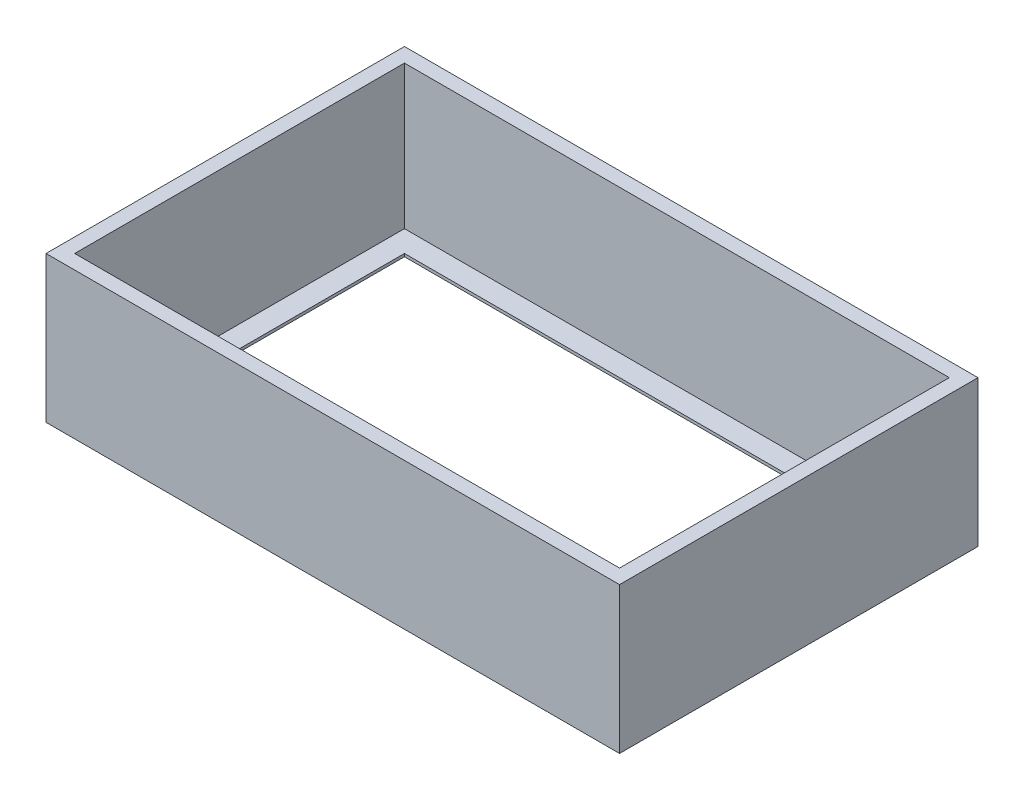
ISO-10303-21;
HEADER;
FILE_DESCRIPTION(('STEP AP214'),'2;1');
FILE_NAME('part.step','',(''),(''),'','','');
FILE_SCHEMA(('AUTOMOTIVE_DESIGN { 1 0 10303 214 1 1 1 1 }'));
ENDSEC;
DATA;
#1=APPLICATION_CONTEXT('core data for automotive mechanical design processes');
#2=APPLICATION_PROTOCOL_DEFINITION('international standard','automotive_design',2000,#1);
#3=PRODUCT_CONTEXT('',#1,'mechanical');
#4=PRODUCT('Part','Part','',(#3));
#5=PRODUCT_RELATED_PRODUCT_CATEGORY('part','',(#4));
#6=PRODUCT_DEFINITION_FORMATION('','',#4);
#7=PRODUCT_DEFINITION_CONTEXT('part definition',#1,'design');
#8=PRODUCT_DEFINITION('design','',#6,#7);
#9=PRODUCT_DEFINITION_SHAPE('','',#8);
#10=(LENGTH_UNIT() NAMED_UNIT(*) SI_UNIT(.MILLI.,.METRE.));
#11=(NAMED_UNIT(*) PLANE_ANGLE_UNIT() SI_UNIT($,.RADIAN.));
#12=(NAMED_UNIT(*) SI_UNIT($,.STERADIAN.) SOLID_ANGLE_UNIT());
#13=UNCERTAINTY_MEASURE_WITH_UNIT(LENGTH_MEASURE(1.E-05),#10,'distance_accuracy_value','');
#14=(GEOMETRIC_REPRESENTATION_CONTEXT(3) GLOBAL_UNCERTAINTY_ASSIGNED_CONTEXT((#13)) GLOBAL_UNIT_ASSIGNED_CONTEXT((#10,
#11,#12)) REPRESENTATION_CONTEXT('',''));
#15=CARTESIAN_POINT('',(0.,0.,0.));
#16=DIRECTION('',(0.,0.,1.));
#17=DIRECTION('',(1.,0.,0.));
#18=AXIS2_PLACEMENT_3D('',#15,#16,#17);
#19=CARTESIAN_POINT('',(0.973770477967721,0.4,0.77550022203393));
#20=DIRECTION('',(1.,0.,0.));
#21=DIRECTION('',(0.,0.,-1.));
#22=AXIS2_PLACEMENT_3D('',#19,#20,#21);
#23=PLANE('',#22);
#24=DIRECTION('',(0.,0.,1.));
#25=VECTOR('',#24,1.);
#26=CARTESIAN_POINT('',(0.973770477967721,0.,0.77550022203393));
#27=LINE('',#26,#25);
#28=CARTESIAN_POINT('',(0.973770477967721,0.,0.77550022203393));
#29=VERTEX_POINT('',#28);
#30=CARTESIAN_POINT('',(0.973770477967721,0.,50.7755002220339));
#31=VERTEX_POINT('',#30);
#32=EDGE_CURVE('E189',#29,#31,#27,.T.);
#33=ORIENTED_EDGE('',*,*,#32,.T.);
#34=DIRECTION('',(0.,-1.,0.));
#35=VECTOR('',#34,1.);
#36=CARTESIAN_POINT('',(0.973770477967721,0.4,50.7755002220339));
#37=LINE('',#36,#35);
#38=CARTESIAN_POINT('',(0.973770477967721,20.4,50.7755002220339));
#39=VERTEX_POINT('',#38);
#40=EDGE_CURVE('E207',#39,#31,#37,.T.);
#41=ORIENTED_EDGE('',*,*,#40,.F.);
#42=DIRECTION('',(0.,0.,1.));
#43=VECTOR('',#42,1.);
#44=CARTESIAN_POINT('',(0.973770477967721,20.4,0.77550022203393));
#45=LINE('',#44,#43);
#46=CARTESIAN_POINT('',(0.973770477967721,20.4,0.77550022203393));
#47=VERTEX_POINT('',#46);
#48=EDGE_CURVE('E177',#47,#39,#45,.T.);
#49=ORIENTED_EDGE('',*,*,#48,.F.);
#50=DIRECTION('',(0.,-1.,0.));
#51=VECTOR('',#50,1.);
#52=CARTESIAN_POINT('',(0.973770477967721,0.4,0.77550022203393));
#53=LINE('',#52,#51);
#54=EDGE_CURVE('E198',#47,#29,#53,.T.);
#55=ORIENTED_EDGE('',*,*,#54,.T.);
#56=EDGE_LOOP('',(#33,#41,#49,#55));
#57=FACE_BOUND('',#56,.T.);
#58=ADVANCED_FACE('F33',(#57),#23,.F.);
#59=CARTESIAN_POINT('',(0.973770477967721,0.4,50.7755002220339));
#60=DIRECTION('',(0.,0.,-1.));
#61=DIRECTION('',(-1.,0.,0.));
#62=AXIS2_PLACEMENT_3D('',#59,#60,#61);
#63=PLANE('',#62);
#64=DIRECTION('',(1.,0.,0.));
#65=VECTOR('',#64,1.);
#66=CARTESIAN_POINT('',(0.973770477967721,0.,50.7755002220339));
#67=LINE('',#66,#65);
#68=CARTESIAN_POINT('',(80.9737704779677,0.,50.7755002220339));
#69=VERTEX_POINT('',#68);
#70=EDGE_CURVE('E192',#31,#69,#67,.T.);
#71=ORIENTED_EDGE('',*,*,#70,.T.);
#72=DIRECTION('',(0.,-1.,0.));
#73=VECTOR('',#72,1.);
#74=CARTESIAN_POINT('',(80.9737704779677,0.4,50.7755002220339));
#75=LINE('',#74,#73);
#76=CARTESIAN_POINT('',(80.9737704779677,20.4,50.7755002220339));
#77=VERTEX_POINT('',#76);
#78=EDGE_CURVE('E204',#77,#69,#75,.T.);
#79=ORIENTED_EDGE('',*,*,#78,.F.);
#80=DIRECTION('',(1.,0.,0.));
#81=VECTOR('',#80,1.);
#82=CARTESIAN_POINT('',(0.973770477967721,20.4,50.7755002220339));
#83=LINE('',#82,#81);
#84=EDGE_CURVE('E180',#39,#77,#83,.T.);
#85=ORIENTED_EDGE('',*,*,#84,.F.);
#86=ORIENTED_EDGE('',*,*,#40,.T.);
#87=EDGE_LOOP('',(#71,#79,#85,#86));
#88=FACE_BOUND('',#87,.T.);
#89=ADVANCED_FACE('F233',(#88),#63,.F.);
#90=CARTESIAN_POINT('',(80.9737704779677,0.4,0.775500222033924));
#91=DIRECTION('',(-1.,0.,0.));
#92=DIRECTION('',(0.,0.,1.));
#93=AXIS2_PLACEMENT_3D('',#90,#91,#92);
#94=PLANE('',#93);
#95=DIRECTION('',(0.,0.,-1.));
#96=VECTOR('',#95,1.);
#97=CARTESIAN_POINT('',(80.9737704779677,0.,0.775500222033924));
#98=LINE('',#97,#96);
#99=CARTESIAN_POINT('',(80.9737704779677,0.,0.775500222033924));
#100=VERTEX_POINT('',#99);
#101=EDGE_CURVE('E194',#69,#100,#98,.T.);
#102=ORIENTED_EDGE('',*,*,#101,.T.);
#103=DIRECTION('',(0.,-1.,0.));
#104=VECTOR('',#103,1.);
#105=CARTESIAN_POINT('',(80.9737704779677,0.4,0.775500222033924));
#106=LINE('',#105,#104);
#107=CARTESIAN_POINT('',(80.9737704779677,20.4,0.77550022203393));
#108=VERTEX_POINT('',#107);
#109=EDGE_CURVE('E201',#108,#100,#106,.T.);
#110=ORIENTED_EDGE('',*,*,#109,.F.);
#111=DIRECTION('',(0.,0.,-1.));
#112=VECTOR('',#111,1.);
#113=CARTESIAN_POINT('',(80.9737704779677,20.4,0.77550022203393));
#114=LINE('',#113,#112);
#115=EDGE_CURVE('E183',#77,#108,#114,.T.);
#116=ORIENTED_EDGE('',*,*,#115,.F.);
#117=ORIENTED_EDGE('',*,*,#78,.T.);
#118=EDGE_LOOP('',(#102,#110,#116,#117));
#119=FACE_BOUND('',#118,.T.);
#120=ADVANCED_FACE('F238',(#119),#94,.F.);
#121=CARTESIAN_POINT('',(0.973770477967721,0.4,0.77550022203393));
#122=DIRECTION('',(0.,0.,1.));
#123=DIRECTION('',(1.,0.,0.));
#124=AXIS2_PLACEMENT_3D('',#121,#122,#123);
#125=PLANE('',#124);
#126=DIRECTION('',(-1.,0.,0.));
#127=VECTOR('',#126,1.);
#128=CARTESIAN_POINT('',(0.973770477967721,0.,0.77550022203393));
#129=LINE('',#128,#127);
#130=EDGE_CURVE('E196',#100,#29,#129,.T.);
#131=ORIENTED_EDGE('',*,*,#130,.T.);
#132=ORIENTED_EDGE('',*,*,#54,.F.);
#133=DIRECTION('',(-1.,0.,0.));
#134=VECTOR('',#133,1.);
#135=CARTESIAN_POINT('',(0.973770477967721,20.4,0.77550022203393));
#136=LINE('',#135,#134);
#137=EDGE_CURVE('E186',#108,#47,#136,.T.);
#138=ORIENTED_EDGE('',*,*,#137,.F.);
#139=ORIENTED_EDGE('',*,*,#109,.T.);
#140=EDGE_LOOP('',(#131,#132,#138,#139));
#141=FACE_BOUND('',#140,.T.);
#142=ADVANCED_FACE('F251',(#141),#125,.F.);
#143=CARTESIAN_POINT('',(0.,0.,0.));
#144=DIRECTION('',(0.,1.,0.));
#145=DIRECTION('',(0.,0.,1.));
#146=AXIS2_PLACEMENT_3D('',#143,#144,#145);
#147=PLANE('',#146);
#148=DIRECTION('',(0.,0.,1.));
#149=VECTOR('',#148,1.);
#150=CARTESIAN_POINT('',(75.9737704779677,0.,5.77550022203393));
#151=LINE('',#150,#149);
#152=CARTESIAN_POINT('',(75.9737704779677,0.,5.77550022203393));
#153=VERTEX_POINT('',#152);
#154=CARTESIAN_POINT('',(75.9737704779677,0.,45.7755002220339));
#155=VERTEX_POINT('',#154);
#156=EDGE_CURVE('E132',#153,#155,#151,.T.);
#157=ORIENTED_EDGE('',*,*,#156,.F.);
#158=DIRECTION('',(1.,0.,0.));
#159=VECTOR('',#158,1.);
#160=CARTESIAN_POINT('',(5.97377047796772,0.,5.77550022203392));
#161=LINE('',#160,#159);
#162=CARTESIAN_POINT('',(5.97377047796772,0.,5.77550022203392));
#163=VERTEX_POINT('',#162);
#164=EDGE_CURVE('E47',#163,#153,#161,.T.);
#165=ORIENTED_EDGE('',*,*,#164,.F.);
#166=DIRECTION('',(0.,0.,-1.));
#167=VECTOR('',#166,1.);
#168=CARTESIAN_POINT('',(5.97377047796772,0.,5.77550022203392));
#169=LINE('',#168,#167);
#170=CARTESIAN_POINT('',(5.97377047796772,0.,45.7755002220339));
#171=VERTEX_POINT('',#170);
#172=EDGE_CURVE('E139',#171,#163,#169,.T.);
#173=ORIENTED_EDGE('',*,*,#172,.F.);
#174=DIRECTION('',(-1.,0.,0.));
#175=VECTOR('',#174,1.);
#176=CARTESIAN_POINT('',(5.97377047796772,0.,45.7755002220339));
#177=LINE('',#176,#175);
#178=EDGE_CURVE('E123',#155,#171,#177,.T.);
#179=ORIENTED_EDGE('',*,*,#178,.F.);
#180=EDGE_LOOP('',(#157,#165,#173,#179));
#181=FACE_BOUND('',#180,.T.);
#182=ORIENTED_EDGE('',*,*,#32,.F.);
#183=ORIENTED_EDGE('',*,*,#130,.F.);
#184=ORIENTED_EDGE('',*,*,#101,.F.);
#185=ORIENTED_EDGE('',*,*,#70,.F.);
#186=EDGE_LOOP('',(#182,#183,#184,#185));
#187=FACE_BOUND('',#186,.T.);
#188=ADVANCED_FACE('F136',(#181,#187),#147,.F.);
#189=CARTESIAN_POINT('',(0.,20.4,0.));
#190=DIRECTION('',(0.,1.,0.));
#191=DIRECTION('',(0.,0.,1.));
#192=AXIS2_PLACEMENT_3D('',#189,#190,#191);
#193=PLANE('',#192);
#194=ORIENTED_EDGE('',*,*,#48,.T.);
#195=ORIENTED_EDGE('',*,*,#84,.T.);
#196=ORIENTED_EDGE('',*,*,#115,.T.);
#197=ORIENTED_EDGE('',*,*,#137,.T.);
#198=EDGE_LOOP('',(#194,#195,#196,#197));
#199=FACE_BOUND('',#198,.T.);
#200=DIRECTION('',(0.,0.,1.));
#201=VECTOR('',#200,1.);
#202=CARTESIAN_POINT('',(2.97377047796772,20.4,2.77550022203393));
#203=LINE('',#202,#201);
#204=CARTESIAN_POINT('',(2.97377047796772,20.4,2.77550022203393));
#205=VERTEX_POINT('',#204);
#206=CARTESIAN_POINT('',(2.97377047796773,20.4,48.7755002220339));
#207=VERTEX_POINT('',#206);
#208=EDGE_CURVE('E151',#205,#207,#203,.T.);
#209=ORIENTED_EDGE('',*,*,#208,.F.);
#210=DIRECTION('',(-1.,0.,0.));
#211=VECTOR('',#210,1.);
#212=CARTESIAN_POINT('',(2.97377047796772,20.4,2.77550022203393));
#213=LINE('',#212,#211);
#214=CARTESIAN_POINT('',(78.9737704779677,20.4,2.77550022203393));
#215=VERTEX_POINT('',#214);
#216=EDGE_CURVE('E149',#215,#205,#213,.T.);
#217=ORIENTED_EDGE('',*,*,#216,.F.);
#218=DIRECTION('',(0.,0.,-1.));
#219=VECTOR('',#218,1.);
#220=CARTESIAN_POINT('',(78.9737704779677,20.4,2.77550022203393));
#221=LINE('',#220,#219);
#222=CARTESIAN_POINT('',(78.9737704779677,20.4,48.7755002220339));
#223=VERTEX_POINT('',#222);
#224=EDGE_CURVE('E157',#223,#215,#221,.T.);
#225=ORIENTED_EDGE('',*,*,#224,.F.);
#226=DIRECTION('',(1.,0.,0.));
#227=VECTOR('',#226,1.);
#228=CARTESIAN_POINT('',(2.97377047796773,20.4,48.7755002220339));
#229=LINE('',#228,#227);
#230=EDGE_CURVE('E154',#207,#223,#229,.T.);
#231=ORIENTED_EDGE('',*,*,#230,.F.);
#232=EDGE_LOOP('',(#209,#217,#225,#231));
#233=FACE_BOUND('',#232,.T.);
#234=ADVANCED_FACE('F247',(#199,#233),#193,.T.);
#235=CARTESIAN_POINT('',(2.97377047796772,20.4,2.77550022203393));
#236=DIRECTION('',(0.,0.,1.));
#237=DIRECTION('',(1.,0.,0.));
#238=AXIS2_PLACEMENT_3D('',#235,#236,#237);
#239=PLANE('',#238);
#240=DIRECTION('',(-1.,0.,0.));
#241=VECTOR('',#240,1.);
#242=CARTESIAN_POINT('',(2.97377047796772,0.4,2.77550022203393));
#243=LINE('',#242,#241);
#244=CARTESIAN_POINT('',(78.9737704779677,0.4,2.77550022203393));
#245=VERTEX_POINT('',#244);
#246=CARTESIAN_POINT('',(2.97377047796772,0.4,2.77550022203393));
#247=VERTEX_POINT('',#246);
#248=EDGE_CURVE('E146',#245,#247,#243,.T.);
#249=ORIENTED_EDGE('',*,*,#248,.F.);
#250=DIRECTION('',(0.,-1.,0.));
#251=VECTOR('',#250,1.);
#252=CARTESIAN_POINT('',(78.9737704779677,20.4,2.77550022203393));
#253=LINE('',#252,#251);
#254=EDGE_CURVE('E159',#215,#245,#253,.T.);
#255=ORIENTED_EDGE('',*,*,#254,.F.);
#256=ORIENTED_EDGE('',*,*,#216,.T.);
#257=DIRECTION('',(0.,-1.,0.));
#258=VECTOR('',#257,1.);
#259=CARTESIAN_POINT('',(2.97377047796772,20.4,2.77550022203393));
#260=LINE('',#259,#258);
#261=EDGE_CURVE('E174',#205,#247,#260,.T.);
#262=ORIENTED_EDGE('',*,*,#261,.T.);
#263=EDGE_LOOP('',(#249,#255,#256,#262));
#264=FACE_BOUND('',#263,.T.);
#265=ADVANCED_FACE('F264',(#264),#239,.T.);
#266=CARTESIAN_POINT('',(2.97377047796772,20.4,2.77550022203393));
#267=DIRECTION('',(1.,0.,0.));
#268=DIRECTION('',(0.,0.,-1.));
#269=AXIS2_PLACEMENT_3D('',#266,#267,#268);
#270=PLANE('',#269);
#271=DIRECTION('',(0.,0.,1.));
#272=VECTOR('',#271,1.);
#273=CARTESIAN_POINT('',(2.97377047796772,0.4,2.77550022203393));
#274=LINE('',#273,#272);
#275=CARTESIAN_POINT('',(2.97377047796773,0.4,48.7755002220339));
#276=VERTEX_POINT('',#275);
#277=EDGE_CURVE('E161',#247,#276,#274,.T.);
#278=ORIENTED_EDGE('',*,*,#277,.F.);
#279=ORIENTED_EDGE('',*,*,#261,.F.);
#280=ORIENTED_EDGE('',*,*,#208,.T.);
#281=DIRECTION('',(0.,-1.,0.));
#282=VECTOR('',#281,1.);
#283=CARTESIAN_POINT('',(2.97377047796773,20.4,48.7755002220339));
#284=LINE('',#283,#282);
#285=EDGE_CURVE('E171',#207,#276,#284,.T.);
#286=ORIENTED_EDGE('',*,*,#285,.T.);
#287=EDGE_LOOP('',(#278,#279,#280,#286));
#288=FACE_BOUND('',#287,.T.);
#289=ADVANCED_FACE('F267',(#288),#270,.T.);
#290=CARTESIAN_POINT('',(2.97377047796773,20.4,48.7755002220339));
#291=DIRECTION('',(0.,0.,-1.));
#292=DIRECTION('',(-1.,0.,0.));
#293=AXIS2_PLACEMENT_3D('',#290,#291,#292);
#294=PLANE('',#293);
#295=DIRECTION('',(1.,0.,0.));
#296=VECTOR('',#295,1.);
#297=CARTESIAN_POINT('',(2.97377047796773,0.4,48.7755002220339));
#298=LINE('',#297,#296);
#299=CARTESIAN_POINT('',(78.9737704779677,0.4,48.7755002220339));
#300=VERTEX_POINT('',#299);
#301=EDGE_CURVE('E163',#276,#300,#298,.T.);
#302=ORIENTED_EDGE('',*,*,#301,.F.);
#303=ORIENTED_EDGE('',*,*,#285,.F.);
#304=ORIENTED_EDGE('',*,*,#230,.T.);
#305=DIRECTION('',(0.,-1.,0.));
#306=VECTOR('',#305,1.);
#307=CARTESIAN_POINT('',(78.9737704779677,20.4,48.7755002220339));
#308=LINE('',#307,#306);
#309=EDGE_CURVE('E168',#223,#300,#308,.T.);
#310=ORIENTED_EDGE('',*,*,#309,.T.);
#311=EDGE_LOOP('',(#302,#303,#304,#310));
#312=FACE_BOUND('',#311,.T.);
#313=ADVANCED_FACE('F271',(#312),#294,.T.);
#314=CARTESIAN_POINT('',(78.9737704779677,20.4,2.77550022203393));
#315=DIRECTION('',(-1.,0.,0.));
#316=DIRECTION('',(0.,0.,1.));
#317=AXIS2_PLACEMENT_3D('',#314,#315,#316);
#318=PLANE('',#317);
#319=DIRECTION('',(0.,0.,-1.));
#320=VECTOR('',#319,1.);
#321=CARTESIAN_POINT('',(78.9737704779677,0.4,2.77550022203393));
#322=LINE('',#321,#320);
#323=EDGE_CURVE('E152',#300,#245,#322,.T.);
#324=ORIENTED_EDGE('',*,*,#323,.F.);
#325=ORIENTED_EDGE('',*,*,#309,.F.);
#326=ORIENTED_EDGE('',*,*,#224,.T.);
#327=ORIENTED_EDGE('',*,*,#254,.T.);
#328=EDGE_LOOP('',(#324,#325,#326,#327));
#329=FACE_BOUND('',#328,.T.);
#330=ADVANCED_FACE('F228',(#329),#318,.T.);
#331=CARTESIAN_POINT('',(0.,0.4,0.));
#332=DIRECTION('',(0.,1.,0.));
#333=DIRECTION('',(0.,0.,1.));
#334=AXIS2_PLACEMENT_3D('',#331,#332,#333);
#335=PLANE('',#334);
#336=DIRECTION('',(-1.,0.,0.));
#337=VECTOR('',#336,1.);
#338=CARTESIAN_POINT('',(0.,0.4,5.77550022203392));
#339=LINE('',#338,#337);
#340=CARTESIAN_POINT('',(75.9737704779677,0.400000000000001,5.77550022203393));
#341=VERTEX_POINT('',#340);
#342=CARTESIAN_POINT('',(5.97377047796772,0.400000000000001,5.77550022203392));
#343=VERTEX_POINT('',#342);
#344=EDGE_CURVE('E11',#341,#343,#339,.T.);
#345=ORIENTED_EDGE('',*,*,#344,.F.);
#346=DIRECTION('',(0.,0.,-1.));
#347=VECTOR('',#346,1.);
#348=CARTESIAN_POINT('',(75.9737704779677,0.4,0.));
#349=LINE('',#348,#347);
#350=CARTESIAN_POINT('',(75.9737704779677,0.4,45.7755002220339));
#351=VERTEX_POINT('',#350);
#352=EDGE_CURVE('E210',#351,#341,#349,.T.);
#353=ORIENTED_EDGE('',*,*,#352,.F.);
#354=DIRECTION('',(1.,0.,0.));
#355=VECTOR('',#354,1.);
#356=CARTESIAN_POINT('',(0.,0.4,45.7755002220339));
#357=LINE('',#356,#355);
#358=CARTESIAN_POINT('',(5.97377047796772,0.400000000000001,45.7755002220339));
#359=VERTEX_POINT('',#358);
#360=EDGE_CURVE('E126',#359,#351,#357,.T.);
#361=ORIENTED_EDGE('',*,*,#360,.F.);
#362=DIRECTION('',(0.,0.,1.));
#363=VECTOR('',#362,1.);
#364=CARTESIAN_POINT('',(5.97377047796772,0.4,0.));
#365=LINE('',#364,#363);
#366=EDGE_CURVE('E40',#343,#359,#365,.T.);
#367=ORIENTED_EDGE('',*,*,#366,.F.);
#368=EDGE_LOOP('',(#345,#353,#361,#367));
#369=FACE_BOUND('',#368,.T.);
#370=ORIENTED_EDGE('',*,*,#248,.T.);
#371=ORIENTED_EDGE('',*,*,#277,.T.);
#372=ORIENTED_EDGE('',*,*,#301,.T.);
#373=ORIENTED_EDGE('',*,*,#323,.T.);
#374=EDGE_LOOP('',(#370,#371,#372,#373));
#375=FACE_BOUND('',#374,.T.);
#376=ADVANCED_FACE('F218',(#369,#375),#335,.T.);
#377=CARTESIAN_POINT('',(5.97377047796772,20.4,5.77550022203392));
#378=DIRECTION('',(0.,0.,-1.));
#379=DIRECTION('',(-1.,0.,0.));
#380=AXIS2_PLACEMENT_3D('',#377,#378,#379);
#381=PLANE('',#380);
#382=ORIENTED_EDGE('',*,*,#344,.T.);
#383=DIRECTION('',(0.,-1.,0.));
#384=VECTOR('',#383,1.);
#385=CARTESIAN_POINT('',(5.97377047796772,20.4,5.77550022203392));
#386=LINE('',#385,#384);
#387=EDGE_CURVE('E144',#343,#163,#386,.T.);
#388=ORIENTED_EDGE('',*,*,#387,.T.);
#389=ORIENTED_EDGE('',*,*,#164,.T.);
#390=DIRECTION('',(0.,-1.,0.));
#391=VECTOR('',#390,1.);
#392=CARTESIAN_POINT('',(75.9737704779677,20.4,5.77550022203393));
#393=LINE('',#392,#391);
#394=EDGE_CURVE('E129',#341,#153,#393,.T.);
#395=ORIENTED_EDGE('',*,*,#394,.F.);
#396=EDGE_LOOP('',(#382,#388,#389,#395));
#397=FACE_BOUND('',#396,.T.);
#398=ADVANCED_FACE('F220',(#397),#381,.F.);
#399=CARTESIAN_POINT('',(5.97377047796772,20.4,5.77550022203392));
#400=DIRECTION('',(-1.,0.,0.));
#401=DIRECTION('',(0.,0.,1.));
#402=AXIS2_PLACEMENT_3D('',#399,#400,#401);
#403=PLANE('',#402);
#404=ORIENTED_EDGE('',*,*,#366,.T.);
#405=DIRECTION('',(0.,-1.,0.));
#406=VECTOR('',#405,1.);
#407=CARTESIAN_POINT('',(5.97377047796772,20.4,45.7755002220339));
#408=LINE('',#407,#406);
#409=EDGE_CURVE('E128',#359,#171,#408,.T.);
#410=ORIENTED_EDGE('',*,*,#409,.T.);
#411=ORIENTED_EDGE('',*,*,#172,.T.);
#412=ORIENTED_EDGE('',*,*,#387,.F.);
#413=EDGE_LOOP('',(#404,#410,#411,#412));
#414=FACE_BOUND('',#413,.T.);
#415=ADVANCED_FACE('F215',(#414),#403,.F.);
#416=CARTESIAN_POINT('',(5.97377047796772,20.4,45.7755002220339));
#417=DIRECTION('',(0.,0.,1.));
#418=DIRECTION('',(1.,0.,0.));
#419=AXIS2_PLACEMENT_3D('',#416,#417,#418);
#420=PLANE('',#419);
#421=ORIENTED_EDGE('',*,*,#360,.T.);
#422=DIRECTION('',(0.,-1.,0.));
#423=VECTOR('',#422,1.);
#424=CARTESIAN_POINT('',(75.9737704779677,20.4,45.7755002220339));
#425=LINE('',#424,#423);
#426=EDGE_CURVE('E55',#351,#155,#425,.T.);
#427=ORIENTED_EDGE('',*,*,#426,.T.);
#428=ORIENTED_EDGE('',*,*,#178,.T.);
#429=ORIENTED_EDGE('',*,*,#409,.F.);
#430=EDGE_LOOP('',(#421,#427,#428,#429));
#431=FACE_BOUND('',#430,.T.);
#432=ADVANCED_FACE('F120',(#431),#420,.F.);
#433=CARTESIAN_POINT('',(75.9737704779677,20.4,5.77550022203393));
#434=DIRECTION('',(1.,0.,0.));
#435=DIRECTION('',(0.,0.,-1.));
#436=AXIS2_PLACEMENT_3D('',#433,#434,#435);
#437=PLANE('',#436);
#438=ORIENTED_EDGE('',*,*,#352,.T.);
#439=ORIENTED_EDGE('',*,*,#394,.T.);
#440=ORIENTED_EDGE('',*,*,#156,.T.);
#441=ORIENTED_EDGE('',*,*,#426,.F.);
#442=EDGE_LOOP('',(#438,#439,#440,#441));
#443=FACE_BOUND('',#442,.T.);
#444=ADVANCED_FACE('F133',(#443),#437,.F.);
#445=CLOSED_SHELL('',(#58,#89,#120,#142,#188,#234,#265,#289,#313,#330,#376,#398,#415,#432,#444));
#446=MANIFOLD_SOLID_BREP('B2',#445);
#447=ADVANCED_BREP_SHAPE_REPRESENTATION('',(#18,#446),#14);
#448=SHAPE_DEFINITION_REPRESENTATION(#9,#447);
ENDSEC;
END-ISO-10303-21;
